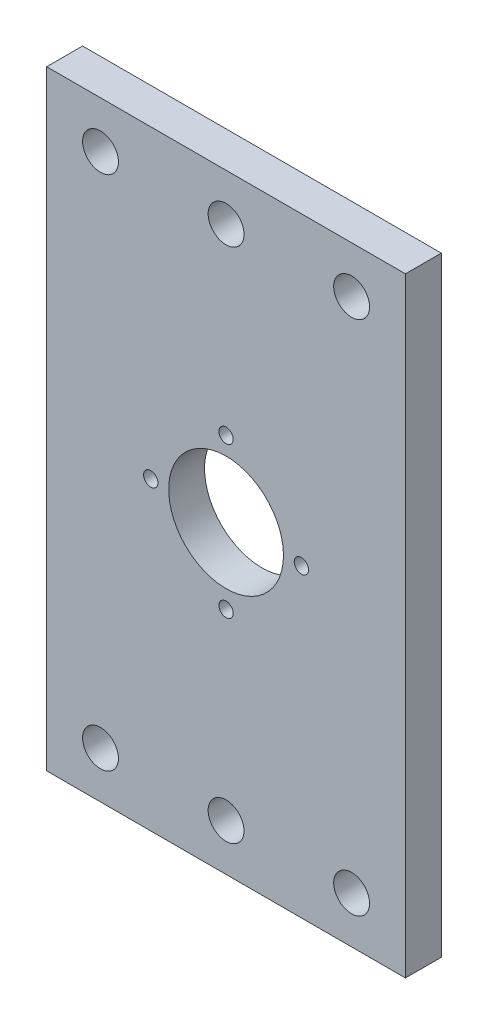
ISO-10303-21;
HEADER;
FILE_DESCRIPTION(('STEP AP214'),'2;1');
FILE_NAME('part.step','',(''),(''),'','','');
FILE_SCHEMA(('AUTOMOTIVE_DESIGN { 1 0 10303 214 1 1 1 1 }'));
ENDSEC;
DATA;
#1=APPLICATION_CONTEXT('core data for automotive mechanical design processes');
#2=APPLICATION_PROTOCOL_DEFINITION('international standard','automotive_design',2000,#1);
#3=PRODUCT_CONTEXT('',#1,'mechanical');
#4=PRODUCT('Part','Part','',(#3));
#5=PRODUCT_RELATED_PRODUCT_CATEGORY('part','',(#4));
#6=PRODUCT_DEFINITION_FORMATION('','',#4);
#7=PRODUCT_DEFINITION_CONTEXT('part definition',#1,'design');
#8=PRODUCT_DEFINITION('design','',#6,#7);
#9=PRODUCT_DEFINITION_SHAPE('','',#8);
#10=(LENGTH_UNIT() NAMED_UNIT(*) SI_UNIT(.MILLI.,.METRE.));
#11=(NAMED_UNIT(*) PLANE_ANGLE_UNIT() SI_UNIT($,.RADIAN.));
#12=(NAMED_UNIT(*) SI_UNIT($,.STERADIAN.) SOLID_ANGLE_UNIT());
#13=UNCERTAINTY_MEASURE_WITH_UNIT(LENGTH_MEASURE(1.E-05),#10,'distance_accuracy_value','');
#14=(GEOMETRIC_REPRESENTATION_CONTEXT(3) GLOBAL_UNCERTAINTY_ASSIGNED_CONTEXT((#13)) GLOBAL_UNIT_ASSIGNED_CONTEXT((#10,
#11,#12)) REPRESENTATION_CONTEXT('',''));
#15=CARTESIAN_POINT('',(0.,0.,0.));
#16=DIRECTION('',(0.,0.,1.));
#17=DIRECTION('',(1.,0.,0.));
#18=AXIS2_PLACEMENT_3D('',#15,#16,#17);
#19=CARTESIAN_POINT('',(50.,85.,10.));
#20=DIRECTION('',(0.,-1.,0.));
#21=DIRECTION('',(0.,0.,-1.));
#22=AXIS2_PLACEMENT_3D('',#19,#20,#21);
#23=PLANE('',#22);
#24=DIRECTION('',(-1.,0.,0.));
#25=VECTOR('',#24,1.);
#26=CARTESIAN_POINT('',(50.,85.,0.));
#27=LINE('',#26,#25);
#28=CARTESIAN_POINT('',(50.,85.,0.));
#29=VERTEX_POINT('',#28);
#30=CARTESIAN_POINT('',(-50.,85.,0.));
#31=VERTEX_POINT('',#30);
#32=EDGE_CURVE('E94',#29,#31,#27,.T.);
#33=ORIENTED_EDGE('',*,*,#32,.T.);
#34=DIRECTION('',(0.,0.,-1.));
#35=VECTOR('',#34,1.);
#36=CARTESIAN_POINT('',(-50.,85.,10.));
#37=LINE('',#36,#35);
#38=CARTESIAN_POINT('',(-50.,85.,10.));
#39=VERTEX_POINT('',#38);
#40=EDGE_CURVE('E48',#39,#31,#37,.T.);
#41=ORIENTED_EDGE('',*,*,#40,.F.);
#42=DIRECTION('',(-1.,0.,0.));
#43=VECTOR('',#42,1.);
#44=CARTESIAN_POINT('',(50.,85.,10.));
#45=LINE('',#44,#43);
#46=CARTESIAN_POINT('',(50.,85.,10.));
#47=VERTEX_POINT('',#46);
#48=EDGE_CURVE('E83',#47,#39,#45,.T.);
#49=ORIENTED_EDGE('',*,*,#48,.F.);
#50=DIRECTION('',(0.,0.,-1.));
#51=VECTOR('',#50,1.);
#52=CARTESIAN_POINT('',(50.,85.,10.));
#53=LINE('',#52,#51);
#54=EDGE_CURVE('E11',#47,#29,#53,.T.);
#55=ORIENTED_EDGE('',*,*,#54,.T.);
#56=EDGE_LOOP('',(#33,#41,#49,#55));
#57=FACE_BOUND('',#56,.T.);
#58=ADVANCED_FACE('F39',(#57),#23,.F.);
#59=CARTESIAN_POINT('',(-50.,-85.,10.));
#60=DIRECTION('',(-1.,0.,0.));
#61=DIRECTION('',(0.,-1.,0.));
#62=AXIS2_PLACEMENT_3D('',#59,#60,#61);
#63=PLANE('',#62);
#64=DIRECTION('',(0.,1.,0.));
#65=VECTOR('',#64,1.);
#66=CARTESIAN_POINT('',(-50.,-85.,0.));
#67=LINE('',#66,#65);
#68=CARTESIAN_POINT('',(-50.,-85.,0.));
#69=VERTEX_POINT('',#68);
#70=EDGE_CURVE('E107',#69,#31,#67,.T.);
#71=ORIENTED_EDGE('',*,*,#70,.F.);
#72=DIRECTION('',(0.,0.,-1.));
#73=VECTOR('',#72,1.);
#74=CARTESIAN_POINT('',(-50.,-85.,10.));
#75=LINE('',#74,#73);
#76=CARTESIAN_POINT('',(-50.,-85.,10.));
#77=VERTEX_POINT('',#76);
#78=EDGE_CURVE('E74',#77,#69,#75,.T.);
#79=ORIENTED_EDGE('',*,*,#78,.F.);
#80=DIRECTION('',(0.,1.,0.));
#81=VECTOR('',#80,1.);
#82=CARTESIAN_POINT('',(-50.,-40.,10.));
#83=LINE('',#82,#81);
#84=EDGE_CURVE('E88',#77,#39,#83,.T.);
#85=ORIENTED_EDGE('',*,*,#84,.T.);
#86=ORIENTED_EDGE('',*,*,#40,.T.);
#87=EDGE_LOOP('',(#71,#79,#85,#86));
#88=FACE_BOUND('',#87,.T.);
#89=ADVANCED_FACE('F97',(#88),#63,.T.);
#90=CARTESIAN_POINT('',(50.,-85.,10.));
#91=DIRECTION('',(0.,-1.,0.));
#92=DIRECTION('',(1.,0.,0.));
#93=AXIS2_PLACEMENT_3D('',#90,#91,#92);
#94=PLANE('',#93);
#95=DIRECTION('',(-1.,0.,0.));
#96=VECTOR('',#95,1.);
#97=CARTESIAN_POINT('',(50.,-85.,0.));
#98=LINE('',#97,#96);
#99=CARTESIAN_POINT('',(50.,-85.,0.));
#100=VERTEX_POINT('',#99);
#101=EDGE_CURVE('E111',#100,#69,#98,.T.);
#102=ORIENTED_EDGE('',*,*,#101,.F.);
#103=DIRECTION('',(0.,0.,-1.));
#104=VECTOR('',#103,1.);
#105=CARTESIAN_POINT('',(50.,-85.,10.));
#106=LINE('',#105,#104);
#107=CARTESIAN_POINT('',(50.,-85.,10.));
#108=VERTEX_POINT('',#107);
#109=EDGE_CURVE('E77',#108,#100,#106,.T.);
#110=ORIENTED_EDGE('',*,*,#109,.F.);
#111=DIRECTION('',(-1.,0.,0.));
#112=VECTOR('',#111,1.);
#113=CARTESIAN_POINT('',(50.,-85.,10.));
#114=LINE('',#113,#112);
#115=EDGE_CURVE('E99',#108,#77,#114,.T.);
#116=ORIENTED_EDGE('',*,*,#115,.T.);
#117=ORIENTED_EDGE('',*,*,#78,.T.);
#118=EDGE_LOOP('',(#102,#110,#116,#117));
#119=FACE_BOUND('',#118,.T.);
#120=ADVANCED_FACE('F241',(#119),#94,.T.);
#121=CARTESIAN_POINT('',(50.,0.,10.));
#122=DIRECTION('',(1.,0.,0.));
#123=DIRECTION('',(0.,1.,0.));
#124=AXIS2_PLACEMENT_3D('',#121,#122,#123);
#125=PLANE('',#124);
#126=DIRECTION('',(0.,-1.,0.));
#127=VECTOR('',#126,1.);
#128=CARTESIAN_POINT('',(50.,0.,0.));
#129=LINE('',#128,#127);
#130=EDGE_CURVE('E115',#29,#100,#129,.T.);
#131=ORIENTED_EDGE('',*,*,#130,.F.);
#132=ORIENTED_EDGE('',*,*,#54,.F.);
#133=DIRECTION('',(0.,1.,0.));
#134=VECTOR('',#133,1.);
#135=CARTESIAN_POINT('',(50.,0.,10.));
#136=LINE('',#135,#134);
#137=EDGE_CURVE('E56',#108,#47,#136,.T.);
#138=ORIENTED_EDGE('',*,*,#137,.F.);
#139=ORIENTED_EDGE('',*,*,#109,.T.);
#140=EDGE_LOOP('',(#131,#132,#138,#139));
#141=FACE_BOUND('',#140,.T.);
#142=ADVANCED_FACE('F239',(#141),#125,.T.);
#143=CARTESIAN_POINT('',(0.,0.,10.));
#144=DIRECTION('',(0.,0.,1.));
#145=DIRECTION('',(1.,0.,0.));
#146=AXIS2_PLACEMENT_3D('',#143,#144,#145);
#147=PLANE('',#146);
#148=CARTESIAN_POINT('',(-35.,72.,10.));
#149=DIRECTION('',(0.,0.,-1.));
#150=DIRECTION('',(1.,0.,0.));
#151=AXIS2_PLACEMENT_3D('',#148,#149,#150);
#152=CIRCLE('',#151,5.);
#153=CARTESIAN_POINT('',(-30.,72.,10.));
#154=VERTEX_POINT('',#153);
#155=EDGE_CURVE('E197',#154,#154,#152,.T.);
#156=ORIENTED_EDGE('',*,*,#155,.T.);
#157=EDGE_LOOP('',(#156));
#158=FACE_BOUND('',#157,.T.);
#159=CARTESIAN_POINT('',(35.,72.,10.));
#160=DIRECTION('',(0.,0.,-1.));
#161=DIRECTION('',(1.,0.,0.));
#162=AXIS2_PLACEMENT_3D('',#159,#160,#161);
#163=CIRCLE('',#162,5.);
#164=CARTESIAN_POINT('',(40.,72.,10.));
#165=VERTEX_POINT('',#164);
#166=EDGE_CURVE('E205',#165,#165,#163,.T.);
#167=ORIENTED_EDGE('',*,*,#166,.T.);
#168=EDGE_LOOP('',(#167));
#169=FACE_BOUND('',#168,.T.);
#170=CARTESIAN_POINT('',(0.,72.,10.));
#171=DIRECTION('',(0.,0.,-1.));
#172=DIRECTION('',(1.,0.,0.));
#173=AXIS2_PLACEMENT_3D('',#170,#171,#172);
#174=CIRCLE('',#173,5.);
#175=CARTESIAN_POINT('',(5.00000000000001,72.,10.));
#176=VERTEX_POINT('',#175);
#177=EDGE_CURVE('E189',#176,#176,#174,.T.);
#178=ORIENTED_EDGE('',*,*,#177,.T.);
#179=EDGE_LOOP('',(#178));
#180=FACE_BOUND('',#179,.T.);
#181=CARTESIAN_POINT('',(-21.,0.,10.));
#182=DIRECTION('',(0.,0.,1.));
#183=DIRECTION('',(0.,1.,0.));
#184=AXIS2_PLACEMENT_3D('',#181,#182,#183);
#185=CIRCLE('',#184,2.);
#186=CARTESIAN_POINT('',(-21.,1.99999999999993,10.));
#187=VERTEX_POINT('',#186);
#188=EDGE_CURVE('E182',#187,#187,#185,.T.);
#189=ORIENTED_EDGE('',*,*,#188,.F.);
#190=EDGE_LOOP('',(#189));
#191=FACE_BOUND('',#190,.T.);
#192=CARTESIAN_POINT('',(0.,-21.,10.));
#193=DIRECTION('',(0.,0.,1.));
#194=DIRECTION('',(-1.,0.,0.));
#195=AXIS2_PLACEMENT_3D('',#192,#193,#194);
#196=CIRCLE('',#195,2.);
#197=CARTESIAN_POINT('',(-2.,-21.,10.));
#198=VERTEX_POINT('',#197);
#199=EDGE_CURVE('E174',#198,#198,#196,.T.);
#200=ORIENTED_EDGE('',*,*,#199,.F.);
#201=EDGE_LOOP('',(#200));
#202=FACE_BOUND('',#201,.T.);
#203=CARTESIAN_POINT('',(21.,2.19963324347117E-13,10.));
#204=DIRECTION('',(0.,0.,1.));
#205=DIRECTION('',(0.,-1.,0.));
#206=AXIS2_PLACEMENT_3D('',#203,#204,#205);
#207=CIRCLE('',#206,2.);
#208=CARTESIAN_POINT('',(21.,-1.99999999999978,10.));
#209=VERTEX_POINT('',#208);
#210=EDGE_CURVE('E165',#209,#209,#207,.T.);
#211=ORIENTED_EDGE('',*,*,#210,.F.);
#212=EDGE_LOOP('',(#211));
#213=FACE_BOUND('',#212,.T.);
#214=CARTESIAN_POINT('',(0.,21.,10.));
#215=DIRECTION('',(0.,0.,1.));
#216=DIRECTION('',(1.,0.,0.));
#217=AXIS2_PLACEMENT_3D('',#214,#215,#216);
#218=CIRCLE('',#217,2.);
#219=CARTESIAN_POINT('',(2.,21.,10.));
#220=VERTEX_POINT('',#219);
#221=EDGE_CURVE('E157',#220,#220,#218,.T.);
#222=ORIENTED_EDGE('',*,*,#221,.F.);
#223=EDGE_LOOP('',(#222));
#224=FACE_BOUND('',#223,.T.);
#225=CARTESIAN_POINT('',(-35.,-72.,10.));
#226=DIRECTION('',(0.,0.,1.));
#227=DIRECTION('',(1.,0.,0.));
#228=AXIS2_PLACEMENT_3D('',#225,#226,#227);
#229=CIRCLE('',#228,5.);
#230=CARTESIAN_POINT('',(-30.,-72.,10.));
#231=VERTEX_POINT('',#230);
#232=EDGE_CURVE('E141',#231,#231,#229,.T.);
#233=ORIENTED_EDGE('',*,*,#232,.F.);
#234=EDGE_LOOP('',(#233));
#235=FACE_BOUND('',#234,.T.);
#236=CARTESIAN_POINT('',(35.,-72.,10.));
#237=DIRECTION('',(0.,0.,1.));
#238=DIRECTION('',(1.,0.,0.));
#239=AXIS2_PLACEMENT_3D('',#236,#237,#238);
#240=CIRCLE('',#239,5.);
#241=CARTESIAN_POINT('',(40.,-72.,10.));
#242=VERTEX_POINT('',#241);
#243=EDGE_CURVE('E150',#242,#242,#240,.T.);
#244=ORIENTED_EDGE('',*,*,#243,.F.);
#245=EDGE_LOOP('',(#244));
#246=FACE_BOUND('',#245,.T.);
#247=CARTESIAN_POINT('',(0.,-72.,10.));
#248=DIRECTION('',(0.,0.,1.));
#249=DIRECTION('',(1.,0.,0.));
#250=AXIS2_PLACEMENT_3D('',#247,#248,#249);
#251=CIRCLE('',#250,5.);
#252=CARTESIAN_POINT('',(5.00000000000001,-72.,10.));
#253=VERTEX_POINT('',#252);
#254=EDGE_CURVE('E133',#253,#253,#251,.T.);
#255=ORIENTED_EDGE('',*,*,#254,.F.);
#256=EDGE_LOOP('',(#255));
#257=FACE_BOUND('',#256,.T.);
#258=CARTESIAN_POINT('',(0.,0.,10.));
#259=DIRECTION('',(0.,0.,1.));
#260=DIRECTION('',(1.,0.,0.));
#261=AXIS2_PLACEMENT_3D('',#258,#259,#260);
#262=CIRCLE('',#261,16.);
#263=CARTESIAN_POINT('',(16.,0.,10.));
#264=VERTEX_POINT('',#263);
#265=EDGE_CURVE('E125',#264,#264,#262,.T.);
#266=ORIENTED_EDGE('',*,*,#265,.F.);
#267=EDGE_LOOP('',(#266));
#268=FACE_BOUND('',#267,.T.);
#269=ORIENTED_EDGE('',*,*,#137,.T.);
#270=ORIENTED_EDGE('',*,*,#48,.T.);
#271=ORIENTED_EDGE('',*,*,#84,.F.);
#272=ORIENTED_EDGE('',*,*,#115,.F.);
#273=EDGE_LOOP('',(#269,#270,#271,#272));
#274=FACE_BOUND('',#273,.T.);
#275=ADVANCED_FACE('F85',(#158,#169,#180,#191,#202,#213,#224,#235,#246,#257,#268,#274),#147,.T.);
#276=CARTESIAN_POINT('',(0.,0.,0.));
#277=DIRECTION('',(0.,0.,1.));
#278=DIRECTION('',(1.,0.,0.));
#279=AXIS2_PLACEMENT_3D('',#276,#277,#278);
#280=PLANE('',#279);
#281=CARTESIAN_POINT('',(-35.,72.,0.));
#282=DIRECTION('',(0.,0.,-1.));
#283=DIRECTION('',(1.,0.,0.));
#284=AXIS2_PLACEMENT_3D('',#281,#282,#283);
#285=CIRCLE('',#284,5.);
#286=CARTESIAN_POINT('',(-30.,72.,0.));
#287=VERTEX_POINT('',#286);
#288=EDGE_CURVE('E201',#287,#287,#285,.T.);
#289=ORIENTED_EDGE('',*,*,#288,.F.);
#290=EDGE_LOOP('',(#289));
#291=FACE_BOUND('',#290,.T.);
#292=CARTESIAN_POINT('',(35.,72.,0.));
#293=DIRECTION('',(0.,0.,-1.));
#294=DIRECTION('',(1.,0.,0.));
#295=AXIS2_PLACEMENT_3D('',#292,#293,#294);
#296=CIRCLE('',#295,5.);
#297=CARTESIAN_POINT('',(40.,72.,0.));
#298=VERTEX_POINT('',#297);
#299=EDGE_CURVE('E193',#298,#298,#296,.T.);
#300=ORIENTED_EDGE('',*,*,#299,.F.);
#301=EDGE_LOOP('',(#300));
#302=FACE_BOUND('',#301,.T.);
#303=CARTESIAN_POINT('',(0.,72.,0.));
#304=DIRECTION('',(0.,0.,-1.));
#305=DIRECTION('',(1.,0.,0.));
#306=AXIS2_PLACEMENT_3D('',#303,#304,#305);
#307=CIRCLE('',#306,5.);
#308=CARTESIAN_POINT('',(5.00000000000001,72.,0.));
#309=VERTEX_POINT('',#308);
#310=EDGE_CURVE('E170',#309,#309,#307,.T.);
#311=ORIENTED_EDGE('',*,*,#310,.F.);
#312=EDGE_LOOP('',(#311));
#313=FACE_BOUND('',#312,.T.);
#314=CARTESIAN_POINT('',(-21.,0.,0.));
#315=DIRECTION('',(0.,0.,1.));
#316=DIRECTION('',(0.,1.,0.));
#317=AXIS2_PLACEMENT_3D('',#314,#315,#316);
#318=CIRCLE('',#317,2.);
#319=CARTESIAN_POINT('',(-21.,1.99999999999993,0.));
#320=VERTEX_POINT('',#319);
#321=EDGE_CURVE('E161',#320,#320,#318,.T.);
#322=ORIENTED_EDGE('',*,*,#321,.T.);
#323=EDGE_LOOP('',(#322));
#324=FACE_BOUND('',#323,.T.);
#325=CARTESIAN_POINT('',(0.,-21.,0.));
#326=DIRECTION('',(0.,0.,1.));
#327=DIRECTION('',(-1.,0.,0.));
#328=AXIS2_PLACEMENT_3D('',#325,#326,#327);
#329=CIRCLE('',#328,2.);
#330=CARTESIAN_POINT('',(-2.,-21.,0.));
#331=VERTEX_POINT('',#330);
#332=EDGE_CURVE('E178',#331,#331,#329,.T.);
#333=ORIENTED_EDGE('',*,*,#332,.T.);
#334=EDGE_LOOP('',(#333));
#335=FACE_BOUND('',#334,.T.);
#336=CARTESIAN_POINT('',(21.,2.19963324347117E-13,0.));
#337=DIRECTION('',(0.,0.,1.));
#338=DIRECTION('',(0.,-1.,0.));
#339=AXIS2_PLACEMENT_3D('',#336,#337,#338);
#340=CIRCLE('',#339,2.);
#341=CARTESIAN_POINT('',(21.,-1.99999999999978,0.));
#342=VERTEX_POINT('',#341);
#343=EDGE_CURVE('E169',#342,#342,#340,.T.);
#344=ORIENTED_EDGE('',*,*,#343,.T.);
#345=EDGE_LOOP('',(#344));
#346=FACE_BOUND('',#345,.T.);
#347=CARTESIAN_POINT('',(0.,21.,0.));
#348=DIRECTION('',(0.,0.,1.));
#349=DIRECTION('',(1.,0.,0.));
#350=AXIS2_PLACEMENT_3D('',#347,#348,#349);
#351=CIRCLE('',#350,2.);
#352=CARTESIAN_POINT('',(2.,21.,0.));
#353=VERTEX_POINT('',#352);
#354=EDGE_CURVE('E146',#353,#353,#351,.T.);
#355=ORIENTED_EDGE('',*,*,#354,.T.);
#356=EDGE_LOOP('',(#355));
#357=FACE_BOUND('',#356,.T.);
#358=CARTESIAN_POINT('',(-35.,-72.,0.));
#359=DIRECTION('',(0.,0.,1.));
#360=DIRECTION('',(1.,0.,0.));
#361=AXIS2_PLACEMENT_3D('',#358,#359,#360);
#362=CIRCLE('',#361,5.);
#363=CARTESIAN_POINT('',(-30.,-72.,0.));
#364=VERTEX_POINT('',#363);
#365=EDGE_CURVE('E145',#364,#364,#362,.T.);
#366=ORIENTED_EDGE('',*,*,#365,.T.);
#367=EDGE_LOOP('',(#366));
#368=FACE_BOUND('',#367,.T.);
#369=CARTESIAN_POINT('',(35.,-72.,0.));
#370=DIRECTION('',(0.,0.,1.));
#371=DIRECTION('',(1.,0.,0.));
#372=AXIS2_PLACEMENT_3D('',#369,#370,#371);
#373=CIRCLE('',#372,5.);
#374=CARTESIAN_POINT('',(40.,-72.,0.));
#375=VERTEX_POINT('',#374);
#376=EDGE_CURVE('E137',#375,#375,#373,.T.);
#377=ORIENTED_EDGE('',*,*,#376,.T.);
#378=EDGE_LOOP('',(#377));
#379=FACE_BOUND('',#378,.T.);
#380=CARTESIAN_POINT('',(0.,-72.,0.));
#381=DIRECTION('',(0.,0.,1.));
#382=DIRECTION('',(1.,0.,0.));
#383=AXIS2_PLACEMENT_3D('',#380,#381,#382);
#384=CIRCLE('',#383,5.);
#385=CARTESIAN_POINT('',(5.00000000000001,-72.,0.));
#386=VERTEX_POINT('',#385);
#387=EDGE_CURVE('E129',#386,#386,#384,.T.);
#388=ORIENTED_EDGE('',*,*,#387,.T.);
#389=EDGE_LOOP('',(#388));
#390=FACE_BOUND('',#389,.T.);
#391=CARTESIAN_POINT('',(0.,0.,0.));
#392=DIRECTION('',(0.,0.,1.));
#393=DIRECTION('',(1.,0.,0.));
#394=AXIS2_PLACEMENT_3D('',#391,#392,#393);
#395=CIRCLE('',#394,16.);
#396=CARTESIAN_POINT('',(16.,0.,0.));
#397=VERTEX_POINT('',#396);
#398=EDGE_CURVE('E108',#397,#397,#395,.T.);
#399=ORIENTED_EDGE('',*,*,#398,.T.);
#400=EDGE_LOOP('',(#399));
#401=FACE_BOUND('',#400,.T.);
#402=ORIENTED_EDGE('',*,*,#32,.F.);
#403=ORIENTED_EDGE('',*,*,#130,.T.);
#404=ORIENTED_EDGE('',*,*,#101,.T.);
#405=ORIENTED_EDGE('',*,*,#70,.T.);
#406=EDGE_LOOP('',(#402,#403,#404,#405));
#407=FACE_BOUND('',#406,.T.);
#408=ADVANCED_FACE('F216',(#291,#302,#313,#324,#335,#346,#357,#368,#379,#390,#401,#407),#280,.F.);
#409=CARTESIAN_POINT('',(0.,0.,0.));
#410=DIRECTION('',(0.,0.,1.));
#411=DIRECTION('',(1.,0.,0.));
#412=AXIS2_PLACEMENT_3D('',#409,#410,#411);
#413=CYLINDRICAL_SURFACE('',#412,16.);
#414=ORIENTED_EDGE('',*,*,#398,.F.);
#415=EDGE_LOOP('',(#414));
#416=FACE_BOUND('',#415,.T.);
#417=ORIENTED_EDGE('',*,*,#265,.T.);
#418=EDGE_LOOP('',(#417));
#419=FACE_BOUND('',#418,.T.);
#420=ADVANCED_FACE('F219',(#416,#419),#413,.F.);
#421=CARTESIAN_POINT('',(0.,-72.,0.));
#422=DIRECTION('',(0.,0.,1.));
#423=DIRECTION('',(1.,0.,0.));
#424=AXIS2_PLACEMENT_3D('',#421,#422,#423);
#425=CYLINDRICAL_SURFACE('',#424,5.);
#426=ORIENTED_EDGE('',*,*,#387,.F.);
#427=EDGE_LOOP('',(#426));
#428=FACE_BOUND('',#427,.T.);
#429=ORIENTED_EDGE('',*,*,#254,.T.);
#430=EDGE_LOOP('',(#429));
#431=FACE_BOUND('',#430,.T.);
#432=ADVANCED_FACE('F275',(#428,#431),#425,.F.);
#433=CARTESIAN_POINT('',(35.,-72.,0.));
#434=DIRECTION('',(0.,0.,1.));
#435=DIRECTION('',(1.,0.,0.));
#436=AXIS2_PLACEMENT_3D('',#433,#434,#435);
#437=CYLINDRICAL_SURFACE('',#436,5.);
#438=ORIENTED_EDGE('',*,*,#376,.F.);
#439=EDGE_LOOP('',(#438));
#440=FACE_BOUND('',#439,.T.);
#441=ORIENTED_EDGE('',*,*,#243,.T.);
#442=EDGE_LOOP('',(#441));
#443=FACE_BOUND('',#442,.T.);
#444=ADVANCED_FACE('F286',(#440,#443),#437,.F.);
#445=CARTESIAN_POINT('',(-35.,-72.,0.));
#446=DIRECTION('',(0.,0.,1.));
#447=DIRECTION('',(1.,0.,0.));
#448=AXIS2_PLACEMENT_3D('',#445,#446,#447);
#449=CYLINDRICAL_SURFACE('',#448,5.);
#450=ORIENTED_EDGE('',*,*,#365,.F.);
#451=EDGE_LOOP('',(#450));
#452=FACE_BOUND('',#451,.T.);
#453=ORIENTED_EDGE('',*,*,#232,.T.);
#454=EDGE_LOOP('',(#453));
#455=FACE_BOUND('',#454,.T.);
#456=ADVANCED_FACE('F296',(#452,#455),#449,.F.);
#457=CARTESIAN_POINT('',(0.,21.,0.));
#458=DIRECTION('',(0.,0.,1.));
#459=DIRECTION('',(1.,0.,0.));
#460=AXIS2_PLACEMENT_3D('',#457,#458,#459);
#461=CYLINDRICAL_SURFACE('',#460,2.);
#462=ORIENTED_EDGE('',*,*,#354,.F.);
#463=EDGE_LOOP('',(#462));
#464=FACE_BOUND('',#463,.T.);
#465=ORIENTED_EDGE('',*,*,#221,.T.);
#466=EDGE_LOOP('',(#465));
#467=FACE_BOUND('',#466,.T.);
#468=ADVANCED_FACE('F306',(#464,#467),#461,.F.);
#469=CARTESIAN_POINT('',(21.,2.19963324347117E-13,0.));
#470=DIRECTION('',(0.,0.,1.));
#471=DIRECTION('',(1.,0.,0.));
#472=AXIS2_PLACEMENT_3D('',#469,#470,#471);
#473=CYLINDRICAL_SURFACE('',#472,2.);
#474=ORIENTED_EDGE('',*,*,#343,.F.);
#475=EDGE_LOOP('',(#474));
#476=FACE_BOUND('',#475,.T.);
#477=ORIENTED_EDGE('',*,*,#210,.T.);
#478=EDGE_LOOP('',(#477));
#479=FACE_BOUND('',#478,.T.);
#480=ADVANCED_FACE('F316',(#476,#479),#473,.F.);
#481=CARTESIAN_POINT('',(0.,-21.,0.));
#482=DIRECTION('',(0.,0.,1.));
#483=DIRECTION('',(1.,0.,0.));
#484=AXIS2_PLACEMENT_3D('',#481,#482,#483);
#485=CYLINDRICAL_SURFACE('',#484,2.);
#486=ORIENTED_EDGE('',*,*,#332,.F.);
#487=EDGE_LOOP('',(#486));
#488=FACE_BOUND('',#487,.T.);
#489=ORIENTED_EDGE('',*,*,#199,.T.);
#490=EDGE_LOOP('',(#489));
#491=FACE_BOUND('',#490,.T.);
#492=ADVANCED_FACE('F326',(#488,#491),#485,.F.);
#493=CARTESIAN_POINT('',(-21.,0.,0.));
#494=DIRECTION('',(0.,0.,1.));
#495=DIRECTION('',(1.,0.,0.));
#496=AXIS2_PLACEMENT_3D('',#493,#494,#495);
#497=CYLINDRICAL_SURFACE('',#496,2.);
#498=ORIENTED_EDGE('',*,*,#321,.F.);
#499=EDGE_LOOP('',(#498));
#500=FACE_BOUND('',#499,.T.);
#501=ORIENTED_EDGE('',*,*,#188,.T.);
#502=EDGE_LOOP('',(#501));
#503=FACE_BOUND('',#502,.T.);
#504=ADVANCED_FACE('F336',(#500,#503),#497,.F.);
#505=CARTESIAN_POINT('',(0.,72.,0.));
#506=DIRECTION('',(0.,0.,1.));
#507=DIRECTION('',(1.,0.,0.));
#508=AXIS2_PLACEMENT_3D('',#505,#506,#507);
#509=CYLINDRICAL_SURFACE('',#508,5.);
#510=ORIENTED_EDGE('',*,*,#310,.T.);
#511=EDGE_LOOP('',(#510));
#512=FACE_BOUND('',#511,.T.);
#513=ORIENTED_EDGE('',*,*,#177,.F.);
#514=EDGE_LOOP('',(#513));
#515=FACE_BOUND('',#514,.T.);
#516=ADVANCED_FACE('F346',(#512,#515),#509,.F.);
#517=CARTESIAN_POINT('',(35.,72.,0.));
#518=DIRECTION('',(0.,0.,1.));
#519=DIRECTION('',(1.,0.,0.));
#520=AXIS2_PLACEMENT_3D('',#517,#518,#519);
#521=CYLINDRICAL_SURFACE('',#520,5.);
#522=ORIENTED_EDGE('',*,*,#299,.T.);
#523=EDGE_LOOP('',(#522));
#524=FACE_BOUND('',#523,.T.);
#525=ORIENTED_EDGE('',*,*,#166,.F.);
#526=EDGE_LOOP('',(#525));
#527=FACE_BOUND('',#526,.T.);
#528=ADVANCED_FACE('F213',(#524,#527),#521,.F.);
#529=CARTESIAN_POINT('',(-35.,72.,0.));
#530=DIRECTION('',(0.,0.,1.));
#531=DIRECTION('',(1.,0.,0.));
#532=AXIS2_PLACEMENT_3D('',#529,#530,#531);
#533=CYLINDRICAL_SURFACE('',#532,5.);
#534=ORIENTED_EDGE('',*,*,#288,.T.);
#535=EDGE_LOOP('',(#534));
#536=FACE_BOUND('',#535,.T.);
#537=ORIENTED_EDGE('',*,*,#155,.F.);
#538=EDGE_LOOP('',(#537));
#539=FACE_BOUND('',#538,.T.);
#540=ADVANCED_FACE('F375',(#536,#539),#533,.F.);
#541=CLOSED_SHELL('',(#58,#89,#120,#142,#275,#408,#420,#432,#444,#456,#468,#480,#492,#504,#516,
#528,#540));
#542=MANIFOLD_SOLID_BREP('B2',#541);
#543=ADVANCED_BREP_SHAPE_REPRESENTATION('',(#18,#542),#14);
#544=SHAPE_DEFINITION_REPRESENTATION(#9,#543);
ENDSEC;
END-ISO-10303-21;
